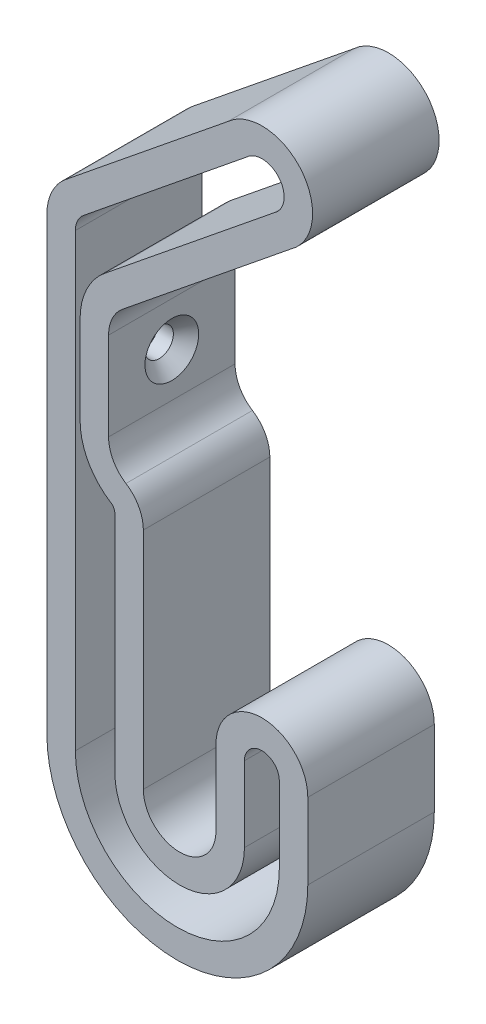
ISO-10303-21;
HEADER;
FILE_DESCRIPTION(('STEP AP214'),'2;1');
FILE_NAME('part.step','',(''),(''),'','','');
FILE_SCHEMA(('AUTOMOTIVE_DESIGN { 1 0 10303 214 1 1 1 1 }'));
ENDSEC;
DATA;
#1=APPLICATION_CONTEXT('core data for automotive mechanical design processes');
#2=APPLICATION_PROTOCOL_DEFINITION('international standard','automotive_design',2000,#1);
#3=PRODUCT_CONTEXT('',#1,'mechanical');
#4=PRODUCT('Part','Part','',(#3));
#5=PRODUCT_RELATED_PRODUCT_CATEGORY('part','',(#4));
#6=PRODUCT_DEFINITION_FORMATION('','',#4);
#7=PRODUCT_DEFINITION_CONTEXT('part definition',#1,'design');
#8=PRODUCT_DEFINITION('design','',#6,#7);
#9=PRODUCT_DEFINITION_SHAPE('','',#8);
#10=(LENGTH_UNIT() NAMED_UNIT(*) SI_UNIT(.MILLI.,.METRE.));
#11=(NAMED_UNIT(*) PLANE_ANGLE_UNIT() SI_UNIT($,.RADIAN.));
#12=(NAMED_UNIT(*) SI_UNIT($,.STERADIAN.) SOLID_ANGLE_UNIT());
#13=UNCERTAINTY_MEASURE_WITH_UNIT(LENGTH_MEASURE(1.E-05),#10,'distance_accuracy_value','');
#14=(GEOMETRIC_REPRESENTATION_CONTEXT(3) GLOBAL_UNCERTAINTY_ASSIGNED_CONTEXT((#13)) GLOBAL_UNIT_ASSIGNED_CONTEXT((#10,
#11,#12)) REPRESENTATION_CONTEXT('',''));
#15=CARTESIAN_POINT('',(0.,0.,0.));
#16=DIRECTION('',(0.,0.,1.));
#17=DIRECTION('',(1.,0.,0.));
#18=AXIS2_PLACEMENT_3D('',#15,#16,#17);
#19=CARTESIAN_POINT('',(8.,-29.1158042615853,20.));
#20=DIRECTION('',(0.,0.,1.));
#21=DIRECTION('',(1.,0.,0.));
#22=AXIS2_PLACEMENT_3D('',#19,#20,#21);
#23=PLANE('',#22);
#24=CARTESIAN_POINT('',(8.,-29.1158042615853,20.));
#25=DIRECTION('',(0.,0.,1.));
#26=DIRECTION('',(1.,0.,0.));
#27=AXIS2_PLACEMENT_3D('',#24,#25,#26);
#28=CIRCLE('',#27,8.);
#29=CARTESIAN_POINT('',(2.96543687160134,-22.8986365699295,20.));
#30=VERTEX_POINT('',#29);
#31=CARTESIAN_POINT('',(0.,-29.1158042615853,20.));
#32=VERTEX_POINT('',#31);
#33=EDGE_CURVE('E349',#30,#32,#28,.T.);
#34=ORIENTED_EDGE('',*,*,#33,.T.);
#35=DIRECTION('',(0.,-1.,0.));
#36=VECTOR('',#35,1.);
#37=CARTESIAN_POINT('',(0.,-100.352508148535,20.));
#38=LINE('',#37,#36);
#39=CARTESIAN_POINT('',(0.,-100.352508148535,20.));
#40=VERTEX_POINT('',#39);
#41=EDGE_CURVE('E352',#32,#40,#38,.T.);
#42=ORIENTED_EDGE('',*,*,#41,.T.);
#43=CARTESIAN_POINT('',(20.625,-100.352508148535,20.));
#44=DIRECTION('',(0.,0.,1.));
#45=DIRECTION('',(1.,0.,0.));
#46=AXIS2_PLACEMENT_3D('',#43,#44,#45);
#47=CIRCLE('',#46,20.625);
#48=CARTESIAN_POINT('',(41.25,-100.352508148535,20.));
#49=VERTEX_POINT('',#48);
#50=EDGE_CURVE('E355',#40,#49,#47,.T.);
#51=ORIENTED_EDGE('',*,*,#50,.T.);
#52=DIRECTION('',(0.,1.,0.));
#53=VECTOR('',#52,1.);
#54=CARTESIAN_POINT('',(41.25,-88.352508148535,20.));
#55=LINE('',#54,#53);
#56=CARTESIAN_POINT('',(41.25,-88.352508148535,20.));
#57=VERTEX_POINT('',#56);
#58=EDGE_CURVE('E357',#49,#57,#55,.T.);
#59=ORIENTED_EDGE('',*,*,#58,.T.);
#60=CARTESIAN_POINT('',(33.99,-88.352508148535,20.));
#61=DIRECTION('',(0.,0.,1.));
#62=DIRECTION('',(1.,0.,0.));
#63=AXIS2_PLACEMENT_3D('',#60,#61,#62);
#64=CIRCLE('',#63,7.26);
#65=CARTESIAN_POINT('',(26.73,-88.352508148535,20.));
#66=VERTEX_POINT('',#65);
#67=EDGE_CURVE('E359',#57,#66,#64,.T.);
#68=ORIENTED_EDGE('',*,*,#67,.T.);
#69=DIRECTION('',(0.,-1.,0.));
#70=VECTOR('',#69,1.);
#71=CARTESIAN_POINT('',(26.73,-100.252508148535,20.));
#72=LINE('',#71,#70);
#73=CARTESIAN_POINT('',(26.73,-100.252508148535,20.));
#74=VERTEX_POINT('',#73);
#75=EDGE_CURVE('E361',#66,#74,#72,.T.);
#76=ORIENTED_EDGE('',*,*,#75,.T.);
#77=CARTESIAN_POINT('',(20.99,-100.252508148535,20.));
#78=DIRECTION('',(0.,0.,-1.));
#79=DIRECTION('',(1.,0.,0.));
#80=AXIS2_PLACEMENT_3D('',#77,#78,#79);
#81=CIRCLE('',#80,5.74);
#82=CARTESIAN_POINT('',(15.25,-100.252508148535,20.));
#83=VERTEX_POINT('',#82);
#84=EDGE_CURVE('E363',#74,#83,#81,.T.);
#85=ORIENTED_EDGE('',*,*,#84,.T.);
#86=DIRECTION('',(0.,1.,0.));
#87=VECTOR('',#86,1.);
#88=CARTESIAN_POINT('',(15.25,-64.752508148535,20.));
#89=LINE('',#88,#87);
#90=CARTESIAN_POINT('',(15.25,-64.752508148535,20.));
#91=VERTEX_POINT('',#90);
#92=EDGE_CURVE('E365',#83,#91,#89,.T.);
#93=ORIENTED_EDGE('',*,*,#92,.T.);
#94=CARTESIAN_POINT('',(9.32954545454545,-64.752508148535,20.));
#95=DIRECTION('',(0.,0.,1.));
#96=DIRECTION('',(1.,0.,0.));
#97=AXIS2_PLACEMENT_3D('',#94,#95,#96);
#98=CIRCLE('',#97,5.92045454545455);
#99=CARTESIAN_POINT('',(12.5,-59.752508148535,20.));
#100=VERTEX_POINT('',#99);
#101=EDGE_CURVE('E367',#91,#100,#98,.T.);
#102=ORIENTED_EDGE('',*,*,#101,.T.);
#103=CARTESIAN_POINT('',(15.6704545454545,-54.752508148535,20.));
#104=DIRECTION('',(0.,0.,-1.));
#105=DIRECTION('',(1.,0.,0.));
#106=AXIS2_PLACEMENT_3D('',#103,#104,#105);
#107=CIRCLE('',#106,5.92045454545455);
#108=CARTESIAN_POINT('',(9.75,-54.752508148535,20.));
#109=VERTEX_POINT('',#108);
#110=EDGE_CURVE('E369',#100,#109,#107,.T.);
#111=ORIENTED_EDGE('',*,*,#110,.T.);
#112=DIRECTION('',(0.,1.,0.));
#113=VECTOR('',#112,1.);
#114=CARTESIAN_POINT('',(9.75,-40.814361344724,20.));
#115=LINE('',#114,#113);
#116=CARTESIAN_POINT('',(9.75,-40.814361344724,20.));
#117=VERTEX_POINT('',#116);
#118=EDGE_CURVE('E371',#109,#117,#115,.T.);
#119=ORIENTED_EDGE('',*,*,#118,.T.);
#120=CARTESIAN_POINT('',(15.75,-40.814361344724,20.));
#121=DIRECTION('',(0.,0.,-1.));
#122=DIRECTION('',(1.,0.,0.));
#123=AXIS2_PLACEMENT_3D('',#120,#121,#122);
#124=CIRCLE('',#123,6.);
#125=CARTESIAN_POINT('',(11.974077653701,-36.1514855759821,20.));
#126=VERTEX_POINT('',#125);
#127=EDGE_CURVE('E373',#117,#126,#124,.T.);
#128=ORIENTED_EDGE('',*,*,#127,.T.);
#129=DIRECTION('',(0.777145961456972,0.629320391049836,0.));
#130=VECTOR('',#129,1.);
#131=CARTESIAN_POINT('',(38.6484121332572,-14.5510354183345,20.));
#132=LINE('',#131,#130);
#133=CARTESIAN_POINT('',(38.6484121332572,-14.5510354183345,20.));
#134=VERTEX_POINT('',#133);
#135=EDGE_CURVE('E375',#126,#134,#132,.T.);
#136=ORIENTED_EDGE('',*,*,#135,.T.);
#137=CARTESIAN_POINT('',(34.0122647381654,-8.03136231832538,20.));
#138=DIRECTION('',(0.,0.,1.));
#139=DIRECTION('',(1.,0.,0.));
#140=AXIS2_PLACEMENT_3D('',#137,#138,#139);
#141=CIRCLE('',#140,8.);
#142=CARTESIAN_POINT('',(28.5989713816166,-2.14100960936603,20.));
#143=VERTEX_POINT('',#142);
#144=EDGE_CURVE('E377',#134,#143,#141,.T.);
#145=ORIENTED_EDGE('',*,*,#144,.T.);
#146=DIRECTION('',(-0.777145961456972,-0.629320391049836,0.));
#147=VECTOR('',#146,1.);
#148=CARTESIAN_POINT('',(2.96543687160134,-22.8986365699295,20.));
#149=LINE('',#148,#147);
#150=EDGE_CURVE('E379',#143,#30,#149,.T.);
#151=ORIENTED_EDGE('',*,*,#150,.T.);
#152=EDGE_LOOP('',(#34,#42,#51,#59,#68,#76,#85,#93,#102,#111,#119,#128,#136,#145,#151));
#153=FACE_BOUND('',#152,.T.);
#154=DIRECTION('',(0.,1.,0.));
#155=VECTOR('',#154,1.);
#156=CARTESIAN_POINT('',(36.75,-88.352508148535,20.));
#157=LINE('',#156,#155);
#158=CARTESIAN_POINT('',(36.75,-100.352508148535,20.));
#159=VERTEX_POINT('',#158);
#160=CARTESIAN_POINT('',(36.75,-88.352508148535,20.));
#161=VERTEX_POINT('',#160);
#162=EDGE_CURVE('E241',#159,#161,#157,.T.);
#163=ORIENTED_EDGE('',*,*,#162,.F.);
#164=CARTESIAN_POINT('',(20.625,-100.352508148535,20.));
#165=DIRECTION('',(0.,0.,1.));
#166=DIRECTION('',(1.,0.,0.));
#167=AXIS2_PLACEMENT_3D('',#164,#165,#166);
#168=CIRCLE('',#167,16.125);
#169=CARTESIAN_POINT('',(4.5,-100.352508148535,20.));
#170=VERTEX_POINT('',#169);
#171=EDGE_CURVE('E233',#170,#159,#168,.T.);
#172=ORIENTED_EDGE('',*,*,#171,.F.);
#173=DIRECTION('',(0.,-1.,0.));
#174=VECTOR('',#173,1.);
#175=CARTESIAN_POINT('',(4.5,-100.352508148535,20.));
#176=LINE('',#175,#174);
#177=CARTESIAN_POINT('',(4.5,-29.1158042615853,20.));
#178=VERTEX_POINT('',#177);
#179=EDGE_CURVE('E281',#178,#170,#176,.T.);
#180=ORIENTED_EDGE('',*,*,#179,.F.);
#181=CARTESIAN_POINT('',(8.,-29.1158042615853,20.));
#182=DIRECTION('',(0.,0.,1.));
#183=DIRECTION('',(1.,0.,0.));
#184=AXIS2_PLACEMENT_3D('',#181,#182,#183);
#185=CIRCLE('',#184,3.5);
#186=CARTESIAN_POINT('',(5.79737863132559,-26.3957933964859,20.));
#187=VERTEX_POINT('',#186);
#188=EDGE_CURVE('E279',#187,#178,#185,.T.);
#189=ORIENTED_EDGE('',*,*,#188,.F.);
#190=DIRECTION('',(-0.777145961456972,-0.629320391049836,0.));
#191=VECTOR('',#190,1.);
#192=CARTESIAN_POINT('',(5.79737863132559,-26.3957933964859,20.));
#193=LINE('',#192,#191);
#194=CARTESIAN_POINT('',(31.5626309732251,-5.5315034387755,20.));
#195=VERTEX_POINT('',#194);
#196=EDGE_CURVE('E277',#195,#187,#193,.T.);
#197=ORIENTED_EDGE('',*,*,#196,.F.);
#198=CARTESIAN_POINT('',(34.0122647381654,-8.03136231832538,20.));
#199=DIRECTION('',(0.,0.,1.));
#200=DIRECTION('',(1.,0.,0.));
#201=AXIS2_PLACEMENT_3D('',#198,#199,#200);
#202=CIRCLE('',#201,3.49999999999999);
#203=CARTESIAN_POINT('',(35.9481882054172,-10.9472155946312,20.));
#204=VERTEX_POINT('',#203);
#205=EDGE_CURVE('E275',#204,#195,#202,.T.);
#206=ORIENTED_EDGE('',*,*,#205,.F.);
#207=DIRECTION('',(0.777145961456972,0.629320391049836,0.));
#208=VECTOR('',#207,1.);
#209=CARTESIAN_POINT('',(35.9481882054172,-10.9472155946312,20.));
#210=LINE('',#209,#208);
#211=CARTESIAN_POINT('',(9.14213589397672,-32.6543287494258,20.));
#212=VERTEX_POINT('',#211);
#213=EDGE_CURVE('E273',#212,#204,#210,.T.);
#214=ORIENTED_EDGE('',*,*,#213,.F.);
#215=CARTESIAN_POINT('',(15.75,-40.814361344724,20.));
#216=DIRECTION('',(0.,0.,-1.));
#217=DIRECTION('',(1.,0.,0.));
#218=AXIS2_PLACEMENT_3D('',#215,#216,#217);
#219=CIRCLE('',#218,10.5);
#220=CARTESIAN_POINT('',(5.25,-40.8143613447241,20.));
#221=VERTEX_POINT('',#220);
#222=EDGE_CURVE('E271',#221,#212,#219,.T.);
#223=ORIENTED_EDGE('',*,*,#222,.F.);
#224=DIRECTION('',(0.,1.,0.));
#225=VECTOR('',#224,1.);
#226=CARTESIAN_POINT('',(5.25,-40.8143613447241,20.));
#227=LINE('',#226,#225);
#228=CARTESIAN_POINT('',(5.25,-54.752508148535,20.));
#229=VERTEX_POINT('',#228);
#230=EDGE_CURVE('E269',#229,#221,#227,.T.);
#231=ORIENTED_EDGE('',*,*,#230,.F.);
#232=CARTESIAN_POINT('',(15.6704545454545,-54.752508148535,20.));
#233=DIRECTION('',(0.,0.,-1.));
#234=DIRECTION('',(1.,0.,0.));
#235=AXIS2_PLACEMENT_3D('',#232,#233,#234);
#236=CIRCLE('',#235,10.4204545454545);
#237=CARTESIAN_POINT('',(10.0902111324376,-63.5528920256943,20.));
#238=VERTEX_POINT('',#237);
#239=EDGE_CURVE('E267',#238,#229,#236,.T.);
#240=ORIENTED_EDGE('',*,*,#239,.F.);
#241=CARTESIAN_POINT('',(9.32954545454545,-64.752508148535,20.));
#242=DIRECTION('',(0.,0.,1.));
#243=DIRECTION('',(1.,0.,0.));
#244=AXIS2_PLACEMENT_3D('',#241,#242,#243);
#245=CIRCLE('',#244,1.42045454545455);
#246=CARTESIAN_POINT('',(10.75,-64.752508148535,20.));
#247=VERTEX_POINT('',#246);
#248=EDGE_CURVE('E265',#247,#238,#245,.T.);
#249=ORIENTED_EDGE('',*,*,#248,.F.);
#250=DIRECTION('',(0.,1.,0.));
#251=VECTOR('',#250,1.);
#252=CARTESIAN_POINT('',(10.75,-64.752508148535,20.));
#253=LINE('',#252,#251);
#254=CARTESIAN_POINT('',(10.75,-100.252508148535,20.));
#255=VERTEX_POINT('',#254);
#256=EDGE_CURVE('E263',#255,#247,#253,.T.);
#257=ORIENTED_EDGE('',*,*,#256,.F.);
#258=CARTESIAN_POINT('',(20.99,-100.252508148535,20.));
#259=DIRECTION('',(0.,0.,-1.));
#260=DIRECTION('',(1.,0.,0.));
#261=AXIS2_PLACEMENT_3D('',#258,#259,#260);
#262=CIRCLE('',#261,10.24);
#263=CARTESIAN_POINT('',(31.23,-100.252508148535,20.));
#264=VERTEX_POINT('',#263);
#265=EDGE_CURVE('E261',#264,#255,#262,.T.);
#266=ORIENTED_EDGE('',*,*,#265,.F.);
#267=DIRECTION('',(0.,-1.,0.));
#268=VECTOR('',#267,1.);
#269=CARTESIAN_POINT('',(31.23,-100.252508148535,20.));
#270=LINE('',#269,#268);
#271=CARTESIAN_POINT('',(31.23,-88.352508148535,20.));
#272=VERTEX_POINT('',#271);
#273=EDGE_CURVE('E256',#272,#264,#270,.T.);
#274=ORIENTED_EDGE('',*,*,#273,.F.);
#275=CARTESIAN_POINT('',(33.99,-88.352508148535,20.));
#276=DIRECTION('',(0.,0.,1.));
#277=DIRECTION('',(1.,0.,0.));
#278=AXIS2_PLACEMENT_3D('',#275,#276,#277);
#279=CIRCLE('',#278,2.76000000000001);
#280=EDGE_CURVE('E254',#161,#272,#279,.T.);
#281=ORIENTED_EDGE('',*,*,#280,.F.);
#282=EDGE_LOOP('',(#163,#172,#180,#189,#197,#206,#214,#223,#231,#240,#249,#257,#266,#274,#281));
#283=FACE_BOUND('',#282,.T.);
#284=ADVANCED_FACE('F35',(#153,#283),#23,.T.);
#285=CARTESIAN_POINT('',(8.,-29.1158042615853,0.));
#286=DIRECTION('',(0.,0.,1.));
#287=DIRECTION('',(1.,0.,0.));
#288=AXIS2_PLACEMENT_3D('',#285,#286,#287);
#289=PLANE('',#288);
#290=CARTESIAN_POINT('',(8.,-29.1158042615853,0.));
#291=DIRECTION('',(0.,0.,1.));
#292=DIRECTION('',(1.,0.,0.));
#293=AXIS2_PLACEMENT_3D('',#290,#291,#292);
#294=CIRCLE('',#293,8.);
#295=CARTESIAN_POINT('',(2.96543687160134,-22.8986365699295,0.));
#296=VERTEX_POINT('',#295);
#297=CARTESIAN_POINT('',(0.,-29.1158042615853,0.));
#298=VERTEX_POINT('',#297);
#299=EDGE_CURVE('E249',#296,#298,#294,.T.);
#300=ORIENTED_EDGE('',*,*,#299,.F.);
#301=DIRECTION('',(-0.777145961456972,-0.629320391049836,0.));
#302=VECTOR('',#301,1.);
#303=CARTESIAN_POINT('',(2.96543687160134,-22.8986365699295,0.));
#304=LINE('',#303,#302);
#305=CARTESIAN_POINT('',(28.5989713816166,-2.14100960936603,0.));
#306=VERTEX_POINT('',#305);
#307=EDGE_CURVE('E353',#306,#296,#304,.T.);
#308=ORIENTED_EDGE('',*,*,#307,.F.);
#309=CARTESIAN_POINT('',(34.0122647381654,-8.03136231832538,0.));
#310=DIRECTION('',(0.,0.,1.));
#311=DIRECTION('',(1.,0.,0.));
#312=AXIS2_PLACEMENT_3D('',#309,#310,#311);
#313=CIRCLE('',#312,8.);
#314=CARTESIAN_POINT('',(38.6484121332572,-14.5510354183345,0.));
#315=VERTEX_POINT('',#314);
#316=EDGE_CURVE('E408',#315,#306,#313,.T.);
#317=ORIENTED_EDGE('',*,*,#316,.F.);
#318=DIRECTION('',(0.777145961456972,0.629320391049836,0.));
#319=VECTOR('',#318,1.);
#320=CARTESIAN_POINT('',(38.6484121332572,-14.5510354183345,0.));
#321=LINE('',#320,#319);
#322=CARTESIAN_POINT('',(11.974077653701,-36.1514855759821,0.));
#323=VERTEX_POINT('',#322);
#324=EDGE_CURVE('E406',#323,#315,#321,.T.);
#325=ORIENTED_EDGE('',*,*,#324,.F.);
#326=CARTESIAN_POINT('',(15.75,-40.814361344724,0.));
#327=DIRECTION('',(0.,0.,-1.));
#328=DIRECTION('',(1.,0.,0.));
#329=AXIS2_PLACEMENT_3D('',#326,#327,#328);
#330=CIRCLE('',#329,6.);
#331=CARTESIAN_POINT('',(9.75,-40.814361344724,0.));
#332=VERTEX_POINT('',#331);
#333=EDGE_CURVE('E404',#332,#323,#330,.T.);
#334=ORIENTED_EDGE('',*,*,#333,.F.);
#335=DIRECTION('',(0.,1.,0.));
#336=VECTOR('',#335,1.);
#337=CARTESIAN_POINT('',(9.75,-40.814361344724,0.));
#338=LINE('',#337,#336);
#339=CARTESIAN_POINT('',(9.75,-54.752508148535,0.));
#340=VERTEX_POINT('',#339);
#341=EDGE_CURVE('E402',#340,#332,#338,.T.);
#342=ORIENTED_EDGE('',*,*,#341,.F.);
#343=CARTESIAN_POINT('',(15.6704545454545,-54.752508148535,0.));
#344=DIRECTION('',(0.,0.,-1.));
#345=DIRECTION('',(1.,0.,0.));
#346=AXIS2_PLACEMENT_3D('',#343,#344,#345);
#347=CIRCLE('',#346,5.92045454545455);
#348=CARTESIAN_POINT('',(12.5,-59.752508148535,0.));
#349=VERTEX_POINT('',#348);
#350=EDGE_CURVE('E400',#349,#340,#347,.T.);
#351=ORIENTED_EDGE('',*,*,#350,.F.);
#352=CARTESIAN_POINT('',(9.32954545454545,-64.752508148535,0.));
#353=DIRECTION('',(0.,0.,1.));
#354=DIRECTION('',(1.,0.,0.));
#355=AXIS2_PLACEMENT_3D('',#352,#353,#354);
#356=CIRCLE('',#355,5.92045454545455);
#357=CARTESIAN_POINT('',(15.25,-64.752508148535,0.));
#358=VERTEX_POINT('',#357);
#359=EDGE_CURVE('E398',#358,#349,#356,.T.);
#360=ORIENTED_EDGE('',*,*,#359,.F.);
#361=DIRECTION('',(0.,1.,0.));
#362=VECTOR('',#361,1.);
#363=CARTESIAN_POINT('',(15.25,-64.752508148535,0.));
#364=LINE('',#363,#362);
#365=CARTESIAN_POINT('',(15.25,-100.252508148535,0.));
#366=VERTEX_POINT('',#365);
#367=EDGE_CURVE('E396',#366,#358,#364,.T.);
#368=ORIENTED_EDGE('',*,*,#367,.F.);
#369=CARTESIAN_POINT('',(20.99,-100.252508148535,0.));
#370=DIRECTION('',(0.,0.,-1.));
#371=DIRECTION('',(1.,0.,0.));
#372=AXIS2_PLACEMENT_3D('',#369,#370,#371);
#373=CIRCLE('',#372,5.74);
#374=CARTESIAN_POINT('',(26.73,-100.252508148535,0.));
#375=VERTEX_POINT('',#374);
#376=EDGE_CURVE('E394',#375,#366,#373,.T.);
#377=ORIENTED_EDGE('',*,*,#376,.F.);
#378=DIRECTION('',(0.,-1.,0.));
#379=VECTOR('',#378,1.);
#380=CARTESIAN_POINT('',(26.73,-100.252508148535,0.));
#381=LINE('',#380,#379);
#382=CARTESIAN_POINT('',(26.73,-88.352508148535,0.));
#383=VERTEX_POINT('',#382);
#384=EDGE_CURVE('E392',#383,#375,#381,.T.);
#385=ORIENTED_EDGE('',*,*,#384,.F.);
#386=CARTESIAN_POINT('',(33.99,-88.352508148535,0.));
#387=DIRECTION('',(0.,0.,1.));
#388=DIRECTION('',(1.,0.,0.));
#389=AXIS2_PLACEMENT_3D('',#386,#387,#388);
#390=CIRCLE('',#389,7.26);
#391=CARTESIAN_POINT('',(41.25,-88.352508148535,0.));
#392=VERTEX_POINT('',#391);
#393=EDGE_CURVE('E390',#392,#383,#390,.T.);
#394=ORIENTED_EDGE('',*,*,#393,.F.);
#395=DIRECTION('',(0.,1.,0.));
#396=VECTOR('',#395,1.);
#397=CARTESIAN_POINT('',(41.25,-88.352508148535,0.));
#398=LINE('',#397,#396);
#399=CARTESIAN_POINT('',(41.25,-100.352508148535,0.));
#400=VERTEX_POINT('',#399);
#401=EDGE_CURVE('E388',#400,#392,#398,.T.);
#402=ORIENTED_EDGE('',*,*,#401,.F.);
#403=CARTESIAN_POINT('',(20.625,-100.352508148535,0.));
#404=DIRECTION('',(0.,0.,1.));
#405=DIRECTION('',(1.,0.,0.));
#406=AXIS2_PLACEMENT_3D('',#403,#404,#405);
#407=CIRCLE('',#406,20.625);
#408=CARTESIAN_POINT('',(0.,-100.352508148535,0.));
#409=VERTEX_POINT('',#408);
#410=EDGE_CURVE('E386',#409,#400,#407,.T.);
#411=ORIENTED_EDGE('',*,*,#410,.F.);
#412=DIRECTION('',(0.,-1.,0.));
#413=VECTOR('',#412,1.);
#414=CARTESIAN_POINT('',(0.,-100.352508148535,0.));
#415=LINE('',#414,#413);
#416=EDGE_CURVE('E384',#298,#409,#415,.T.);
#417=ORIENTED_EDGE('',*,*,#416,.F.);
#418=EDGE_LOOP('',(#300,#308,#317,#325,#334,#342,#351,#360,#368,#377,#385,#394,#402,#411,#417));
#419=FACE_BOUND('',#418,.T.);
#420=CARTESIAN_POINT('',(20.625,-100.352508148535,0.));
#421=DIRECTION('',(0.,0.,1.));
#422=DIRECTION('',(1.,0.,0.));
#423=AXIS2_PLACEMENT_3D('',#420,#421,#422);
#424=CIRCLE('',#423,16.125);
#425=CARTESIAN_POINT('',(4.5,-100.352508148535,0.));
#426=VERTEX_POINT('',#425);
#427=CARTESIAN_POINT('',(36.75,-100.352508148535,0.));
#428=VERTEX_POINT('',#427);
#429=EDGE_CURVE('E59',#426,#428,#424,.T.);
#430=ORIENTED_EDGE('',*,*,#429,.T.);
#431=DIRECTION('',(0.,1.,0.));
#432=VECTOR('',#431,1.);
#433=CARTESIAN_POINT('',(36.75,-88.352508148535,0.));
#434=LINE('',#433,#432);
#435=CARTESIAN_POINT('',(36.75,-88.352508148535,0.));
#436=VERTEX_POINT('',#435);
#437=EDGE_CURVE('E248',#428,#436,#434,.T.);
#438=ORIENTED_EDGE('',*,*,#437,.T.);
#439=CARTESIAN_POINT('',(33.99,-88.352508148535,0.));
#440=DIRECTION('',(0.,0.,1.));
#441=DIRECTION('',(1.,0.,0.));
#442=AXIS2_PLACEMENT_3D('',#439,#440,#441);
#443=CIRCLE('',#442,2.76000000000001);
#444=CARTESIAN_POINT('',(31.23,-88.352508148535,0.));
#445=VERTEX_POINT('',#444);
#446=EDGE_CURVE('E286',#436,#445,#443,.T.);
#447=ORIENTED_EDGE('',*,*,#446,.T.);
#448=DIRECTION('',(0.,-1.,0.));
#449=VECTOR('',#448,1.);
#450=CARTESIAN_POINT('',(31.23,-100.252508148535,0.));
#451=LINE('',#450,#449);
#452=CARTESIAN_POINT('',(31.23,-100.252508148535,0.));
#453=VERTEX_POINT('',#452);
#454=EDGE_CURVE('E289',#445,#453,#451,.T.);
#455=ORIENTED_EDGE('',*,*,#454,.T.);
#456=CARTESIAN_POINT('',(20.99,-100.252508148535,0.));
#457=DIRECTION('',(0.,0.,-1.));
#458=DIRECTION('',(1.,0.,0.));
#459=AXIS2_PLACEMENT_3D('',#456,#457,#458);
#460=CIRCLE('',#459,10.24);
#461=CARTESIAN_POINT('',(10.75,-100.252508148535,0.));
#462=VERTEX_POINT('',#461);
#463=EDGE_CURVE('E292',#453,#462,#460,.T.);
#464=ORIENTED_EDGE('',*,*,#463,.T.);
#465=DIRECTION('',(0.,1.,0.));
#466=VECTOR('',#465,1.);
#467=CARTESIAN_POINT('',(10.75,-64.752508148535,0.));
#468=LINE('',#467,#466);
#469=CARTESIAN_POINT('',(10.75,-64.752508148535,0.));
#470=VERTEX_POINT('',#469);
#471=EDGE_CURVE('E295',#462,#470,#468,.T.);
#472=ORIENTED_EDGE('',*,*,#471,.T.);
#473=CARTESIAN_POINT('',(9.32954545454545,-64.752508148535,0.));
#474=DIRECTION('',(0.,0.,1.));
#475=DIRECTION('',(1.,0.,0.));
#476=AXIS2_PLACEMENT_3D('',#473,#474,#475);
#477=CIRCLE('',#476,1.42045454545455);
#478=CARTESIAN_POINT('',(10.0902111324376,-63.5528920256943,0.));
#479=VERTEX_POINT('',#478);
#480=EDGE_CURVE('E298',#470,#479,#477,.T.);
#481=ORIENTED_EDGE('',*,*,#480,.T.);
#482=CARTESIAN_POINT('',(15.6704545454545,-54.752508148535,0.));
#483=DIRECTION('',(0.,0.,-1.));
#484=DIRECTION('',(1.,0.,0.));
#485=AXIS2_PLACEMENT_3D('',#482,#483,#484);
#486=CIRCLE('',#485,10.4204545454545);
#487=CARTESIAN_POINT('',(5.25,-54.752508148535,0.));
#488=VERTEX_POINT('',#487);
#489=EDGE_CURVE('E301',#479,#488,#486,.T.);
#490=ORIENTED_EDGE('',*,*,#489,.T.);
#491=DIRECTION('',(0.,1.,0.));
#492=VECTOR('',#491,1.);
#493=CARTESIAN_POINT('',(5.25,-40.8143613447241,0.));
#494=LINE('',#493,#492);
#495=CARTESIAN_POINT('',(5.25,-40.8143613447241,0.));
#496=VERTEX_POINT('',#495);
#497=EDGE_CURVE('E304',#488,#496,#494,.T.);
#498=ORIENTED_EDGE('',*,*,#497,.T.);
#499=CARTESIAN_POINT('',(15.75,-40.814361344724,0.));
#500=DIRECTION('',(0.,0.,-1.));
#501=DIRECTION('',(1.,0.,0.));
#502=AXIS2_PLACEMENT_3D('',#499,#500,#501);
#503=CIRCLE('',#502,10.5);
#504=CARTESIAN_POINT('',(9.14213589397672,-32.6543287494258,0.));
#505=VERTEX_POINT('',#504);
#506=EDGE_CURVE('E307',#496,#505,#503,.T.);
#507=ORIENTED_EDGE('',*,*,#506,.T.);
#508=DIRECTION('',(0.777145961456972,0.629320391049836,0.));
#509=VECTOR('',#508,1.);
#510=CARTESIAN_POINT('',(35.9481882054172,-10.9472155946312,0.));
#511=LINE('',#510,#509);
#512=CARTESIAN_POINT('',(35.9481882054172,-10.9472155946312,0.));
#513=VERTEX_POINT('',#512);
#514=EDGE_CURVE('E310',#505,#513,#511,.T.);
#515=ORIENTED_EDGE('',*,*,#514,.T.);
#516=CARTESIAN_POINT('',(34.0122647381654,-8.03136231832538,0.));
#517=DIRECTION('',(0.,0.,1.));
#518=DIRECTION('',(1.,0.,0.));
#519=AXIS2_PLACEMENT_3D('',#516,#517,#518);
#520=CIRCLE('',#519,3.49999999999999);
#521=CARTESIAN_POINT('',(31.5626309732251,-5.5315034387755,0.));
#522=VERTEX_POINT('',#521);
#523=EDGE_CURVE('E313',#513,#522,#520,.T.);
#524=ORIENTED_EDGE('',*,*,#523,.T.);
#525=DIRECTION('',(-0.777145961456972,-0.629320391049836,0.));
#526=VECTOR('',#525,1.);
#527=CARTESIAN_POINT('',(5.79737863132559,-26.3957933964859,0.));
#528=LINE('',#527,#526);
#529=CARTESIAN_POINT('',(5.79737863132559,-26.3957933964859,0.));
#530=VERTEX_POINT('',#529);
#531=EDGE_CURVE('E316',#522,#530,#528,.T.);
#532=ORIENTED_EDGE('',*,*,#531,.T.);
#533=CARTESIAN_POINT('',(8.,-29.1158042615853,0.));
#534=DIRECTION('',(0.,0.,1.));
#535=DIRECTION('',(1.,0.,0.));
#536=AXIS2_PLACEMENT_3D('',#533,#534,#535);
#537=CIRCLE('',#536,3.5);
#538=CARTESIAN_POINT('',(4.5,-29.1158042615853,0.));
#539=VERTEX_POINT('',#538);
#540=EDGE_CURVE('E319',#530,#539,#537,.T.);
#541=ORIENTED_EDGE('',*,*,#540,.T.);
#542=DIRECTION('',(0.,-1.,0.));
#543=VECTOR('',#542,1.);
#544=CARTESIAN_POINT('',(4.5,-100.352508148535,0.));
#545=LINE('',#544,#543);
#546=EDGE_CURVE('E242',#539,#426,#545,.T.);
#547=ORIENTED_EDGE('',*,*,#546,.T.);
#548=EDGE_LOOP('',(#430,#438,#447,#455,#464,#472,#481,#490,#498,#507,#515,#524,#532,#541,#547));
#549=FACE_BOUND('',#548,.T.);
#550=ADVANCED_FACE('F475',(#419,#549),#289,.F.);
#551=CARTESIAN_POINT('',(8.,-29.1158042615853,20.));
#552=DIRECTION('',(0.,0.,-1.));
#553=DIRECTION('',(-1.,0.,0.));
#554=AXIS2_PLACEMENT_3D('',#551,#552,#553);
#555=CYLINDRICAL_SURFACE('',#554,8.);
#556=ORIENTED_EDGE('',*,*,#299,.T.);
#557=DIRECTION('',(0.,0.,-1.));
#558=VECTOR('',#557,1.);
#559=CARTESIAN_POINT('',(0.,-29.1158042615853,20.));
#560=LINE('',#559,#558);
#561=EDGE_CURVE('E452',#32,#298,#560,.T.);
#562=ORIENTED_EDGE('',*,*,#561,.F.);
#563=ORIENTED_EDGE('',*,*,#33,.F.);
#564=DIRECTION('',(0.,0.,-1.));
#565=VECTOR('',#564,1.);
#566=CARTESIAN_POINT('',(2.96543687160134,-22.8986365699295,20.));
#567=LINE('',#566,#565);
#568=EDGE_CURVE('E381',#30,#296,#567,.T.);
#569=ORIENTED_EDGE('',*,*,#568,.T.);
#570=EDGE_LOOP('',(#556,#562,#563,#569));
#571=FACE_BOUND('',#570,.T.);
#572=ADVANCED_FACE('F481',(#571),#555,.T.);
#573=CARTESIAN_POINT('',(0.,-100.352508148535,20.));
#574=DIRECTION('',(1.,0.,0.));
#575=DIRECTION('',(0.,0.,-1.));
#576=AXIS2_PLACEMENT_3D('',#573,#574,#575);
#577=PLANE('',#576);
#578=CARTESIAN_POINT('',(0.,-47.7834347466295,10.));
#579=DIRECTION('',(1.,0.,0.));
#580=DIRECTION('',(0.,1.,0.));
#581=AXIS2_PLACEMENT_3D('',#578,#579,#580);
#582=CIRCLE('',#581,2.25);
#583=CARTESIAN_POINT('',(0.,-45.5334347466295,10.));
#584=VERTEX_POINT('',#583);
#585=EDGE_CURVE('E457',#584,#584,#582,.T.);
#586=ORIENTED_EDGE('',*,*,#585,.T.);
#587=EDGE_LOOP('',(#586));
#588=FACE_BOUND('',#587,.T.);
#589=ORIENTED_EDGE('',*,*,#416,.T.);
#590=DIRECTION('',(0.,0.,-1.));
#591=VECTOR('',#590,1.);
#592=CARTESIAN_POINT('',(0.,-100.352508148535,20.));
#593=LINE('',#592,#591);
#594=EDGE_CURVE('E449',#40,#409,#593,.T.);
#595=ORIENTED_EDGE('',*,*,#594,.F.);
#596=ORIENTED_EDGE('',*,*,#41,.F.);
#597=ORIENTED_EDGE('',*,*,#561,.T.);
#598=EDGE_LOOP('',(#589,#595,#596,#597));
#599=FACE_BOUND('',#598,.T.);
#600=ADVANCED_FACE('F536',(#588,#599),#577,.F.);
#601=CARTESIAN_POINT('',(20.625,-100.352508148535,20.));
#602=DIRECTION('',(0.,0.,-1.));
#603=DIRECTION('',(-1.,0.,0.));
#604=AXIS2_PLACEMENT_3D('',#601,#602,#603);
#605=CYLINDRICAL_SURFACE('',#604,20.625);
#606=ORIENTED_EDGE('',*,*,#410,.T.);
#607=DIRECTION('',(0.,0.,-1.));
#608=VECTOR('',#607,1.);
#609=CARTESIAN_POINT('',(41.25,-100.352508148535,20.));
#610=LINE('',#609,#608);
#611=EDGE_CURVE('E446',#49,#400,#610,.T.);
#612=ORIENTED_EDGE('',*,*,#611,.F.);
#613=ORIENTED_EDGE('',*,*,#50,.F.);
#614=ORIENTED_EDGE('',*,*,#594,.T.);
#615=EDGE_LOOP('',(#606,#612,#613,#614));
#616=FACE_BOUND('',#615,.T.);
#617=ADVANCED_FACE('F532',(#616),#605,.T.);
#618=CARTESIAN_POINT('',(41.25,-88.352508148535,20.));
#619=DIRECTION('',(-1.,0.,0.));
#620=DIRECTION('',(0.,0.,1.));
#621=AXIS2_PLACEMENT_3D('',#618,#619,#620);
#622=PLANE('',#621);
#623=ORIENTED_EDGE('',*,*,#401,.T.);
#624=DIRECTION('',(0.,0.,-1.));
#625=VECTOR('',#624,1.);
#626=CARTESIAN_POINT('',(41.25,-88.352508148535,20.));
#627=LINE('',#626,#625);
#628=EDGE_CURVE('E443',#57,#392,#627,.T.);
#629=ORIENTED_EDGE('',*,*,#628,.F.);
#630=ORIENTED_EDGE('',*,*,#58,.F.);
#631=ORIENTED_EDGE('',*,*,#611,.T.);
#632=EDGE_LOOP('',(#623,#629,#630,#631));
#633=FACE_BOUND('',#632,.T.);
#634=ADVANCED_FACE('F528',(#633),#622,.F.);
#635=CARTESIAN_POINT('',(33.99,-88.352508148535,20.));
#636=DIRECTION('',(0.,0.,-1.));
#637=DIRECTION('',(-1.,0.,0.));
#638=AXIS2_PLACEMENT_3D('',#635,#636,#637);
#639=CYLINDRICAL_SURFACE('',#638,7.26);
#640=ORIENTED_EDGE('',*,*,#393,.T.);
#641=DIRECTION('',(0.,0.,-1.));
#642=VECTOR('',#641,1.);
#643=CARTESIAN_POINT('',(26.73,-88.352508148535,20.));
#644=LINE('',#643,#642);
#645=EDGE_CURVE('E440',#66,#383,#644,.T.);
#646=ORIENTED_EDGE('',*,*,#645,.F.);
#647=ORIENTED_EDGE('',*,*,#67,.F.);
#648=ORIENTED_EDGE('',*,*,#628,.T.);
#649=EDGE_LOOP('',(#640,#646,#647,#648));
#650=FACE_BOUND('',#649,.T.);
#651=ADVANCED_FACE('F524',(#650),#639,.T.);
#652=CARTESIAN_POINT('',(26.73,-100.252508148535,20.));
#653=DIRECTION('',(1.,0.,0.));
#654=DIRECTION('',(0.,0.,-1.));
#655=AXIS2_PLACEMENT_3D('',#652,#653,#654);
#656=PLANE('',#655);
#657=ORIENTED_EDGE('',*,*,#384,.T.);
#658=DIRECTION('',(0.,0.,-1.));
#659=VECTOR('',#658,1.);
#660=CARTESIAN_POINT('',(26.73,-100.252508148535,20.));
#661=LINE('',#660,#659);
#662=EDGE_CURVE('E437',#74,#375,#661,.T.);
#663=ORIENTED_EDGE('',*,*,#662,.F.);
#664=ORIENTED_EDGE('',*,*,#75,.F.);
#665=ORIENTED_EDGE('',*,*,#645,.T.);
#666=EDGE_LOOP('',(#657,#663,#664,#665));
#667=FACE_BOUND('',#666,.T.);
#668=ADVANCED_FACE('F520',(#667),#656,.F.);
#669=CARTESIAN_POINT('',(20.99,-100.252508148535,20.));
#670=DIRECTION('',(0.,0.,-1.));
#671=DIRECTION('',(-1.,0.,0.));
#672=AXIS2_PLACEMENT_3D('',#669,#670,#671);
#673=CYLINDRICAL_SURFACE('',#672,5.74);
#674=ORIENTED_EDGE('',*,*,#376,.T.);
#675=DIRECTION('',(0.,0.,-1.));
#676=VECTOR('',#675,1.);
#677=CARTESIAN_POINT('',(15.25,-100.252508148535,20.));
#678=LINE('',#677,#676);
#679=EDGE_CURVE('E434',#83,#366,#678,.T.);
#680=ORIENTED_EDGE('',*,*,#679,.F.);
#681=ORIENTED_EDGE('',*,*,#84,.F.);
#682=ORIENTED_EDGE('',*,*,#662,.T.);
#683=EDGE_LOOP('',(#674,#680,#681,#682));
#684=FACE_BOUND('',#683,.T.);
#685=ADVANCED_FACE('F516',(#684),#673,.F.);
#686=CARTESIAN_POINT('',(15.25,-64.752508148535,20.));
#687=DIRECTION('',(-1.,0.,0.));
#688=DIRECTION('',(0.,-1.,0.));
#689=AXIS2_PLACEMENT_3D('',#686,#687,#688);
#690=PLANE('',#689);
#691=ORIENTED_EDGE('',*,*,#367,.T.);
#692=DIRECTION('',(0.,0.,-1.));
#693=VECTOR('',#692,1.);
#694=CARTESIAN_POINT('',(15.25,-64.752508148535,20.));
#695=LINE('',#694,#693);
#696=EDGE_CURVE('E431',#91,#358,#695,.T.);
#697=ORIENTED_EDGE('',*,*,#696,.F.);
#698=ORIENTED_EDGE('',*,*,#92,.F.);
#699=ORIENTED_EDGE('',*,*,#679,.T.);
#700=EDGE_LOOP('',(#691,#697,#698,#699));
#701=FACE_BOUND('',#700,.T.);
#702=ADVANCED_FACE('F512',(#701),#690,.F.);
#703=CARTESIAN_POINT('',(9.32954545454545,-64.752508148535,20.));
#704=DIRECTION('',(0.,0.,-1.));
#705=DIRECTION('',(-1.,0.,0.));
#706=AXIS2_PLACEMENT_3D('',#703,#704,#705);
#707=CYLINDRICAL_SURFACE('',#706,5.92045454545455);
#708=ORIENTED_EDGE('',*,*,#359,.T.);
#709=DIRECTION('',(0.,0.,-1.));
#710=VECTOR('',#709,1.);
#711=CARTESIAN_POINT('',(12.5,-59.752508148535,20.));
#712=LINE('',#711,#710);
#713=EDGE_CURVE('E428',#100,#349,#712,.T.);
#714=ORIENTED_EDGE('',*,*,#713,.F.);
#715=ORIENTED_EDGE('',*,*,#101,.F.);
#716=ORIENTED_EDGE('',*,*,#696,.T.);
#717=EDGE_LOOP('',(#708,#714,#715,#716));
#718=FACE_BOUND('',#717,.T.);
#719=ADVANCED_FACE('F508',(#718),#707,.T.);
#720=CARTESIAN_POINT('',(15.6704545454545,-54.752508148535,20.));
#721=DIRECTION('',(0.,0.,-1.));
#722=DIRECTION('',(-1.,0.,0.));
#723=AXIS2_PLACEMENT_3D('',#720,#721,#722);
#724=CYLINDRICAL_SURFACE('',#723,5.92045454545455);
#725=ORIENTED_EDGE('',*,*,#350,.T.);
#726=DIRECTION('',(0.,0.,-1.));
#727=VECTOR('',#726,1.);
#728=CARTESIAN_POINT('',(9.75,-54.752508148535,20.));
#729=LINE('',#728,#727);
#730=EDGE_CURVE('E425',#109,#340,#729,.T.);
#731=ORIENTED_EDGE('',*,*,#730,.F.);
#732=ORIENTED_EDGE('',*,*,#110,.F.);
#733=ORIENTED_EDGE('',*,*,#713,.T.);
#734=EDGE_LOOP('',(#725,#731,#732,#733));
#735=FACE_BOUND('',#734,.T.);
#736=ADVANCED_FACE('F505',(#735),#724,.F.);
#737=CARTESIAN_POINT('',(9.75,-40.814361344724,20.));
#738=DIRECTION('',(-1.,0.,0.));
#739=DIRECTION('',(0.,-1.,0.));
#740=AXIS2_PLACEMENT_3D('',#737,#738,#739);
#741=PLANE('',#740);
#742=CARTESIAN_POINT('',(9.75,-47.7834347466295,10.));
#743=DIRECTION('',(-1.,0.,0.));
#744=DIRECTION('',(0.,-1.,0.));
#745=AXIS2_PLACEMENT_3D('',#742,#743,#744);
#746=CIRCLE('',#745,4.24999999999999);
#747=CARTESIAN_POINT('',(9.75,-52.0334347466295,10.));
#748=VERTEX_POINT('',#747);
#749=EDGE_CURVE('E44',#748,#748,#746,.T.);
#750=ORIENTED_EDGE('',*,*,#749,.T.);
#751=EDGE_LOOP('',(#750));
#752=FACE_BOUND('',#751,.T.);
#753=ORIENTED_EDGE('',*,*,#341,.T.);
#754=DIRECTION('',(0.,0.,-1.));
#755=VECTOR('',#754,1.);
#756=CARTESIAN_POINT('',(9.75,-40.814361344724,20.));
#757=LINE('',#756,#755);
#758=EDGE_CURVE('E422',#117,#332,#757,.T.);
#759=ORIENTED_EDGE('',*,*,#758,.F.);
#760=ORIENTED_EDGE('',*,*,#118,.F.);
#761=ORIENTED_EDGE('',*,*,#730,.T.);
#762=EDGE_LOOP('',(#753,#759,#760,#761));
#763=FACE_BOUND('',#762,.T.);
#764=ADVANCED_FACE('F461',(#752,#763),#741,.F.);
#765=CARTESIAN_POINT('',(15.75,-40.814361344724,20.));
#766=DIRECTION('',(0.,0.,-1.));
#767=DIRECTION('',(-1.,0.,0.));
#768=AXIS2_PLACEMENT_3D('',#765,#766,#767);
#769=CYLINDRICAL_SURFACE('',#768,6.);
#770=ORIENTED_EDGE('',*,*,#333,.T.);
#771=DIRECTION('',(0.,0.,-1.));
#772=VECTOR('',#771,1.);
#773=CARTESIAN_POINT('',(11.974077653701,-36.1514855759821,20.));
#774=LINE('',#773,#772);
#775=EDGE_CURVE('E419',#126,#323,#774,.T.);
#776=ORIENTED_EDGE('',*,*,#775,.F.);
#777=ORIENTED_EDGE('',*,*,#127,.F.);
#778=ORIENTED_EDGE('',*,*,#758,.T.);
#779=EDGE_LOOP('',(#770,#776,#777,#778));
#780=FACE_BOUND('',#779,.T.);
#781=ADVANCED_FACE('F498',(#780),#769,.F.);
#782=CARTESIAN_POINT('',(38.6484121332572,-14.5510354183345,20.));
#783=DIRECTION('',(-0.629320391049836,0.777145961456972,0.));
#784=DIRECTION('',(-0.777145961456972,-0.629320391049836,0.));
#785=AXIS2_PLACEMENT_3D('',#782,#783,#784);
#786=PLANE('',#785);
#787=ORIENTED_EDGE('',*,*,#324,.T.);
#788=DIRECTION('',(0.,0.,-1.));
#789=VECTOR('',#788,1.);
#790=CARTESIAN_POINT('',(38.6484121332572,-14.5510354183345,20.));
#791=LINE('',#790,#789);
#792=EDGE_CURVE('E416',#134,#315,#791,.T.);
#793=ORIENTED_EDGE('',*,*,#792,.F.);
#794=ORIENTED_EDGE('',*,*,#135,.F.);
#795=ORIENTED_EDGE('',*,*,#775,.T.);
#796=EDGE_LOOP('',(#787,#793,#794,#795));
#797=FACE_BOUND('',#796,.T.);
#798=ADVANCED_FACE('F494',(#797),#786,.F.);
#799=CARTESIAN_POINT('',(34.0122647381654,-8.03136231832538,20.));
#800=DIRECTION('',(0.,0.,-1.));
#801=DIRECTION('',(-1.,0.,0.));
#802=AXIS2_PLACEMENT_3D('',#799,#800,#801);
#803=CYLINDRICAL_SURFACE('',#802,8.);
#804=ORIENTED_EDGE('',*,*,#316,.T.);
#805=DIRECTION('',(0.,0.,-1.));
#806=VECTOR('',#805,1.);
#807=CARTESIAN_POINT('',(28.5989713816166,-2.14100960936603,20.));
#808=LINE('',#807,#806);
#809=EDGE_CURVE('E413',#143,#306,#808,.T.);
#810=ORIENTED_EDGE('',*,*,#809,.F.);
#811=ORIENTED_EDGE('',*,*,#144,.F.);
#812=ORIENTED_EDGE('',*,*,#792,.T.);
#813=EDGE_LOOP('',(#804,#810,#811,#812));
#814=FACE_BOUND('',#813,.T.);
#815=ADVANCED_FACE('F490',(#814),#803,.T.);
#816=CARTESIAN_POINT('',(2.96543687160134,-22.8986365699295,20.));
#817=DIRECTION('',(0.629320391049836,-0.777145961456972,0.));
#818=DIRECTION('',(0.777145961456972,0.629320391049836,0.));
#819=AXIS2_PLACEMENT_3D('',#816,#817,#818);
#820=PLANE('',#819);
#821=ORIENTED_EDGE('',*,*,#307,.T.);
#822=ORIENTED_EDGE('',*,*,#568,.F.);
#823=ORIENTED_EDGE('',*,*,#150,.F.);
#824=ORIENTED_EDGE('',*,*,#809,.T.);
#825=EDGE_LOOP('',(#821,#822,#823,#824));
#826=FACE_BOUND('',#825,.T.);
#827=ADVANCED_FACE('F487',(#826),#820,.F.);
#828=CARTESIAN_POINT('',(20.625,-100.352508148535,20.));
#829=DIRECTION('',(0.,0.,-1.));
#830=DIRECTION('',(-1.,0.,0.));
#831=AXIS2_PLACEMENT_3D('',#828,#829,#830);
#832=CYLINDRICAL_SURFACE('',#831,16.125);
#833=ORIENTED_EDGE('',*,*,#429,.F.);
#834=DIRECTION('',(0.,0.,-1.));
#835=VECTOR('',#834,1.);
#836=CARTESIAN_POINT('',(4.5,-100.352508148535,20.));
#837=LINE('',#836,#835);
#838=EDGE_CURVE('E237',#170,#426,#837,.T.);
#839=ORIENTED_EDGE('',*,*,#838,.F.);
#840=ORIENTED_EDGE('',*,*,#171,.T.);
#841=DIRECTION('',(0.,0.,-1.));
#842=VECTOR('',#841,1.);
#843=CARTESIAN_POINT('',(36.75,-100.352508148535,20.));
#844=LINE('',#843,#842);
#845=EDGE_CURVE('E236',#159,#428,#844,.T.);
#846=ORIENTED_EDGE('',*,*,#845,.T.);
#847=EDGE_LOOP('',(#833,#839,#840,#846));
#848=FACE_BOUND('',#847,.T.);
#849=ADVANCED_FACE('F235',(#848),#832,.F.);
#850=CARTESIAN_POINT('',(36.75,-88.352508148535,20.));
#851=DIRECTION('',(-1.,0.,0.));
#852=DIRECTION('',(0.,-1.,0.));
#853=AXIS2_PLACEMENT_3D('',#850,#851,#852);
#854=PLANE('',#853);
#855=ORIENTED_EDGE('',*,*,#437,.F.);
#856=ORIENTED_EDGE('',*,*,#845,.F.);
#857=ORIENTED_EDGE('',*,*,#162,.T.);
#858=DIRECTION('',(0.,0.,-1.));
#859=VECTOR('',#858,1.);
#860=CARTESIAN_POINT('',(36.75,-88.352508148535,20.));
#861=LINE('',#860,#859);
#862=EDGE_CURVE('E250',#161,#436,#861,.T.);
#863=ORIENTED_EDGE('',*,*,#862,.T.);
#864=EDGE_LOOP('',(#855,#856,#857,#863));
#865=FACE_BOUND('',#864,.T.);
#866=ADVANCED_FACE('F245',(#865),#854,.T.);
#867=CARTESIAN_POINT('',(33.99,-88.352508148535,20.));
#868=DIRECTION('',(0.,0.,-1.));
#869=DIRECTION('',(-1.,0.,0.));
#870=AXIS2_PLACEMENT_3D('',#867,#868,#869);
#871=CYLINDRICAL_SURFACE('',#870,2.76000000000001);
#872=ORIENTED_EDGE('',*,*,#446,.F.);
#873=ORIENTED_EDGE('',*,*,#862,.F.);
#874=ORIENTED_EDGE('',*,*,#280,.T.);
#875=DIRECTION('',(0.,0.,-1.));
#876=VECTOR('',#875,1.);
#877=CARTESIAN_POINT('',(31.23,-88.352508148535,20.));
#878=LINE('',#877,#876);
#879=EDGE_CURVE('E346',#272,#445,#878,.T.);
#880=ORIENTED_EDGE('',*,*,#879,.T.);
#881=EDGE_LOOP('',(#872,#873,#874,#880));
#882=FACE_BOUND('',#881,.T.);
#883=ADVANCED_FACE('F646',(#882),#871,.F.);
#884=CARTESIAN_POINT('',(31.23,-100.252508148535,20.));
#885=DIRECTION('',(1.,0.,0.));
#886=DIRECTION('',(0.,1.,0.));
#887=AXIS2_PLACEMENT_3D('',#884,#885,#886);
#888=PLANE('',#887);
#889=ORIENTED_EDGE('',*,*,#454,.F.);
#890=ORIENTED_EDGE('',*,*,#879,.F.);
#891=ORIENTED_EDGE('',*,*,#273,.T.);
#892=DIRECTION('',(0.,0.,-1.));
#893=VECTOR('',#892,1.);
#894=CARTESIAN_POINT('',(31.23,-100.252508148535,20.));
#895=LINE('',#894,#893);
#896=EDGE_CURVE('E344',#264,#453,#895,.T.);
#897=ORIENTED_EDGE('',*,*,#896,.T.);
#898=EDGE_LOOP('',(#889,#890,#891,#897));
#899=FACE_BOUND('',#898,.T.);
#900=ADVANCED_FACE('F642',(#899),#888,.T.);
#901=CARTESIAN_POINT('',(20.99,-100.252508148535,20.));
#902=DIRECTION('',(0.,0.,-1.));
#903=DIRECTION('',(-1.,0.,0.));
#904=AXIS2_PLACEMENT_3D('',#901,#902,#903);
#905=CYLINDRICAL_SURFACE('',#904,10.24);
#906=ORIENTED_EDGE('',*,*,#463,.F.);
#907=ORIENTED_EDGE('',*,*,#896,.F.);
#908=ORIENTED_EDGE('',*,*,#265,.T.);
#909=DIRECTION('',(0.,0.,-1.));
#910=VECTOR('',#909,1.);
#911=CARTESIAN_POINT('',(10.75,-100.252508148535,20.));
#912=LINE('',#911,#910);
#913=EDGE_CURVE('E342',#255,#462,#912,.T.);
#914=ORIENTED_EDGE('',*,*,#913,.T.);
#915=EDGE_LOOP('',(#906,#907,#908,#914));
#916=FACE_BOUND('',#915,.T.);
#917=ADVANCED_FACE('F639',(#916),#905,.T.);
#918=CARTESIAN_POINT('',(10.75,-64.752508148535,20.));
#919=DIRECTION('',(-1.,0.,0.));
#920=DIRECTION('',(0.,0.,1.));
#921=AXIS2_PLACEMENT_3D('',#918,#919,#920);
#922=PLANE('',#921);
#923=ORIENTED_EDGE('',*,*,#471,.F.);
#924=ORIENTED_EDGE('',*,*,#913,.F.);
#925=ORIENTED_EDGE('',*,*,#256,.T.);
#926=DIRECTION('',(0.,0.,-1.));
#927=VECTOR('',#926,1.);
#928=CARTESIAN_POINT('',(10.75,-64.752508148535,20.));
#929=LINE('',#928,#927);
#930=EDGE_CURVE('E340',#247,#470,#929,.T.);
#931=ORIENTED_EDGE('',*,*,#930,.T.);
#932=EDGE_LOOP('',(#923,#924,#925,#931));
#933=FACE_BOUND('',#932,.T.);
#934=ADVANCED_FACE('F633',(#933),#922,.T.);
#935=CARTESIAN_POINT('',(9.32954545454545,-64.752508148535,20.));
#936=DIRECTION('',(0.,0.,-1.));
#937=DIRECTION('',(-1.,0.,0.));
#938=AXIS2_PLACEMENT_3D('',#935,#936,#937);
#939=CYLINDRICAL_SURFACE('',#938,1.42045454545455);
#940=ORIENTED_EDGE('',*,*,#480,.F.);
#941=ORIENTED_EDGE('',*,*,#930,.F.);
#942=ORIENTED_EDGE('',*,*,#248,.T.);
#943=DIRECTION('',(0.,0.,-1.));
#944=VECTOR('',#943,1.);
#945=CARTESIAN_POINT('',(10.0902111324376,-63.5528920256943,20.));
#946=LINE('',#945,#944);
#947=EDGE_CURVE('E338',#238,#479,#946,.T.);
#948=ORIENTED_EDGE('',*,*,#947,.T.);
#949=EDGE_LOOP('',(#940,#941,#942,#948));
#950=FACE_BOUND('',#949,.T.);
#951=ADVANCED_FACE('F629',(#950),#939,.F.);
#952=CARTESIAN_POINT('',(15.6704545454545,-54.752508148535,20.));
#953=DIRECTION('',(0.,0.,-1.));
#954=DIRECTION('',(-1.,0.,0.));
#955=AXIS2_PLACEMENT_3D('',#952,#953,#954);
#956=CYLINDRICAL_SURFACE('',#955,10.4204545454545);
#957=ORIENTED_EDGE('',*,*,#489,.F.);
#958=ORIENTED_EDGE('',*,*,#947,.F.);
#959=ORIENTED_EDGE('',*,*,#239,.T.);
#960=DIRECTION('',(0.,0.,-1.));
#961=VECTOR('',#960,1.);
#962=CARTESIAN_POINT('',(5.25,-54.752508148535,20.));
#963=LINE('',#962,#961);
#964=EDGE_CURVE('E336',#229,#488,#963,.T.);
#965=ORIENTED_EDGE('',*,*,#964,.T.);
#966=EDGE_LOOP('',(#957,#958,#959,#965));
#967=FACE_BOUND('',#966,.T.);
#968=ADVANCED_FACE('F626',(#967),#956,.T.);
#969=CARTESIAN_POINT('',(5.25,-40.8143613447241,20.));
#970=DIRECTION('',(-1.,0.,0.));
#971=DIRECTION('',(0.,-1.,0.));
#972=AXIS2_PLACEMENT_3D('',#969,#970,#971);
#973=PLANE('',#972);
#974=CARTESIAN_POINT('',(5.25,-47.7834347466295,10.));
#975=DIRECTION('',(-1.,0.,0.));
#976=DIRECTION('',(0.,-1.,0.));
#977=AXIS2_PLACEMENT_3D('',#974,#975,#976);
#978=CIRCLE('',#977,2.25);
#979=CARTESIAN_POINT('',(5.25,-50.0334347466295,10.));
#980=VERTEX_POINT('',#979);
#981=EDGE_CURVE('E284',#980,#980,#978,.T.);
#982=ORIENTED_EDGE('',*,*,#981,.F.);
#983=EDGE_LOOP('',(#982));
#984=FACE_BOUND('',#983,.T.);
#985=ORIENTED_EDGE('',*,*,#497,.F.);
#986=ORIENTED_EDGE('',*,*,#964,.F.);
#987=ORIENTED_EDGE('',*,*,#230,.T.);
#988=DIRECTION('',(0.,0.,-1.));
#989=VECTOR('',#988,1.);
#990=CARTESIAN_POINT('',(5.25,-40.8143613447241,20.));
#991=LINE('',#990,#989);
#992=EDGE_CURVE('E334',#221,#496,#991,.T.);
#993=ORIENTED_EDGE('',*,*,#992,.T.);
#994=EDGE_LOOP('',(#985,#986,#987,#993));
#995=FACE_BOUND('',#994,.T.);
#996=ADVANCED_FACE('F618',(#984,#995),#973,.T.);
#997=CARTESIAN_POINT('',(15.75,-40.814361344724,20.));
#998=DIRECTION('',(0.,0.,-1.));
#999=DIRECTION('',(-1.,0.,0.));
#1000=AXIS2_PLACEMENT_3D('',#997,#998,#999);
#1001=CYLINDRICAL_SURFACE('',#1000,10.5);
#1002=ORIENTED_EDGE('',*,*,#506,.F.);
#1003=ORIENTED_EDGE('',*,*,#992,.F.);
#1004=ORIENTED_EDGE('',*,*,#222,.T.);
#1005=DIRECTION('',(0.,0.,-1.));
#1006=VECTOR('',#1005,1.);
#1007=CARTESIAN_POINT('',(9.14213589397672,-32.6543287494258,20.));
#1008=LINE('',#1007,#1006);
#1009=EDGE_CURVE('E332',#212,#505,#1008,.T.);
#1010=ORIENTED_EDGE('',*,*,#1009,.T.);
#1011=EDGE_LOOP('',(#1002,#1003,#1004,#1010));
#1012=FACE_BOUND('',#1011,.T.);
#1013=ADVANCED_FACE('F614',(#1012),#1001,.T.);
#1014=CARTESIAN_POINT('',(35.9481882054172,-10.9472155946312,20.));
#1015=DIRECTION('',(-0.629320391049836,0.777145961456972,0.));
#1016=DIRECTION('',(-0.777145961456972,-0.629320391049836,0.));
#1017=AXIS2_PLACEMENT_3D('',#1014,#1015,#1016);
#1018=PLANE('',#1017);
#1019=ORIENTED_EDGE('',*,*,#514,.F.);
#1020=ORIENTED_EDGE('',*,*,#1009,.F.);
#1021=ORIENTED_EDGE('',*,*,#213,.T.);
#1022=DIRECTION('',(0.,0.,-1.));
#1023=VECTOR('',#1022,1.);
#1024=CARTESIAN_POINT('',(35.9481882054172,-10.9472155946312,20.));
#1025=LINE('',#1024,#1023);
#1026=EDGE_CURVE('E330',#204,#513,#1025,.T.);
#1027=ORIENTED_EDGE('',*,*,#1026,.T.);
#1028=EDGE_LOOP('',(#1019,#1020,#1021,#1027));
#1029=FACE_BOUND('',#1028,.T.);
#1030=ADVANCED_FACE('F611',(#1029),#1018,.T.);
#1031=CARTESIAN_POINT('',(34.0122647381654,-8.03136231832538,20.));
#1032=DIRECTION('',(0.,0.,-1.));
#1033=DIRECTION('',(-1.,0.,0.));
#1034=AXIS2_PLACEMENT_3D('',#1031,#1032,#1033);
#1035=CYLINDRICAL_SURFACE('',#1034,3.49999999999999);
#1036=ORIENTED_EDGE('',*,*,#523,.F.);
#1037=ORIENTED_EDGE('',*,*,#1026,.F.);
#1038=ORIENTED_EDGE('',*,*,#205,.T.);
#1039=DIRECTION('',(0.,0.,-1.));
#1040=VECTOR('',#1039,1.);
#1041=CARTESIAN_POINT('',(31.5626309732251,-5.5315034387755,20.));
#1042=LINE('',#1041,#1040);
#1043=EDGE_CURVE('E328',#195,#522,#1042,.T.);
#1044=ORIENTED_EDGE('',*,*,#1043,.T.);
#1045=EDGE_LOOP('',(#1036,#1037,#1038,#1044));
#1046=FACE_BOUND('',#1045,.T.);
#1047=ADVANCED_FACE('F603',(#1046),#1035,.F.);
#1048=CARTESIAN_POINT('',(5.79737863132559,-26.3957933964859,20.));
#1049=DIRECTION('',(0.629320391049836,-0.777145961456972,0.));
#1050=DIRECTION('',(0.777145961456972,0.629320391049836,0.));
#1051=AXIS2_PLACEMENT_3D('',#1048,#1049,#1050);
#1052=PLANE('',#1051);
#1053=ORIENTED_EDGE('',*,*,#531,.F.);
#1054=ORIENTED_EDGE('',*,*,#1043,.F.);
#1055=ORIENTED_EDGE('',*,*,#196,.T.);
#1056=DIRECTION('',(0.,0.,-1.));
#1057=VECTOR('',#1056,1.);
#1058=CARTESIAN_POINT('',(5.79737863132559,-26.3957933964859,20.));
#1059=LINE('',#1058,#1057);
#1060=EDGE_CURVE('E326',#187,#530,#1059,.T.);
#1061=ORIENTED_EDGE('',*,*,#1060,.T.);
#1062=EDGE_LOOP('',(#1053,#1054,#1055,#1061));
#1063=FACE_BOUND('',#1062,.T.);
#1064=ADVANCED_FACE('F599',(#1063),#1052,.T.);
#1065=CARTESIAN_POINT('',(8.,-29.1158042615853,20.));
#1066=DIRECTION('',(0.,0.,-1.));
#1067=DIRECTION('',(-1.,0.,0.));
#1068=AXIS2_PLACEMENT_3D('',#1065,#1066,#1067);
#1069=CYLINDRICAL_SURFACE('',#1068,3.5);
#1070=ORIENTED_EDGE('',*,*,#540,.F.);
#1071=ORIENTED_EDGE('',*,*,#1060,.F.);
#1072=ORIENTED_EDGE('',*,*,#188,.T.);
#1073=DIRECTION('',(0.,0.,-1.));
#1074=VECTOR('',#1073,1.);
#1075=CARTESIAN_POINT('',(4.5,-29.1158042615853,20.));
#1076=LINE('',#1075,#1074);
#1077=EDGE_CURVE('E51',#178,#539,#1076,.T.);
#1078=ORIENTED_EDGE('',*,*,#1077,.T.);
#1079=EDGE_LOOP('',(#1070,#1071,#1072,#1078));
#1080=FACE_BOUND('',#1079,.T.);
#1081=ADVANCED_FACE('F596',(#1080),#1069,.F.);
#1082=CARTESIAN_POINT('',(4.5,-100.352508148535,20.));
#1083=DIRECTION('',(1.,0.,0.));
#1084=DIRECTION('',(0.,0.,-1.));
#1085=AXIS2_PLACEMENT_3D('',#1082,#1083,#1084);
#1086=PLANE('',#1085);
#1087=CARTESIAN_POINT('',(4.5,-47.7834347466295,10.));
#1088=DIRECTION('',(1.,0.,0.));
#1089=DIRECTION('',(0.,0.,-1.));
#1090=AXIS2_PLACEMENT_3D('',#1087,#1088,#1089);
#1091=CIRCLE('',#1090,2.25);
#1092=CARTESIAN_POINT('',(4.5,-47.7834347466295,7.75));
#1093=VERTEX_POINT('',#1092);
#1094=EDGE_CURVE('E455',#1093,#1093,#1091,.T.);
#1095=ORIENTED_EDGE('',*,*,#1094,.F.);
#1096=EDGE_LOOP('',(#1095));
#1097=FACE_BOUND('',#1096,.T.);
#1098=ORIENTED_EDGE('',*,*,#546,.F.);
#1099=ORIENTED_EDGE('',*,*,#1077,.F.);
#1100=ORIENTED_EDGE('',*,*,#179,.T.);
#1101=ORIENTED_EDGE('',*,*,#838,.T.);
#1102=EDGE_LOOP('',(#1098,#1099,#1100,#1101));
#1103=FACE_BOUND('',#1102,.T.);
#1104=ADVANCED_FACE('F590',(#1097,#1103),#1086,.T.);
#1105=CARTESIAN_POINT('',(0.,-47.7834347466295,10.));
#1106=DIRECTION('',(1.,0.,0.));
#1107=DIRECTION('',(0.,1.,0.));
#1108=AXIS2_PLACEMENT_3D('',#1105,#1106,#1107);
#1109=CYLINDRICAL_SURFACE('',#1108,2.25);
#1110=ORIENTED_EDGE('',*,*,#1094,.T.);
#1111=EDGE_LOOP('',(#1110));
#1112=FACE_BOUND('',#1111,.T.);
#1113=ORIENTED_EDGE('',*,*,#585,.F.);
#1114=EDGE_LOOP('',(#1113));
#1115=FACE_BOUND('',#1114,.T.);
#1116=ADVANCED_FACE('F470',(#1112,#1115),#1109,.F.);
#1117=CARTESIAN_POINT('',(7.75000000000001,-47.7834347466295,10.));
#1118=DIRECTION('',(-1.,0.,0.));
#1119=DIRECTION('',(0.,0.,1.));
#1120=AXIS2_PLACEMENT_3D('',#1117,#1118,#1119);
#1121=CIRCLE('',#1120,2.25);
#1122=CARTESIAN_POINT('',(7.75000000000001,-47.7834347466295,12.25));
#1123=VERTEX_POINT('',#1122);
#1124=EDGE_CURVE('E11',#1123,#1123,#1121,.F.);
#1125=ORIENTED_EDGE('',*,*,#1124,.T.);
#1126=EDGE_LOOP('',(#1125));
#1127=FACE_BOUND('',#1126,.T.);
#1128=ORIENTED_EDGE('',*,*,#981,.T.);
#1129=EDGE_LOOP('',(#1128));
#1130=FACE_BOUND('',#1129,.T.);
#1131=ADVANCED_FACE('F465',(#1127,#1130),#1109,.F.);
#1132=CARTESIAN_POINT('',(9.75,-47.7834347466295,10.));
#1133=DIRECTION('',(1.,0.,0.));
#1134=DIRECTION('',(0.,0.,-1.));
#1135=AXIS2_PLACEMENT_3D('',#1132,#1133,#1134);
#1136=CONICAL_SURFACE('',#1135,4.24999999999999,0.785398163397448);
#1137=ORIENTED_EDGE('',*,*,#1124,.F.);
#1138=EDGE_LOOP('',(#1137));
#1139=FACE_BOUND('',#1138,.T.);
#1140=ORIENTED_EDGE('',*,*,#749,.F.);
#1141=EDGE_LOOP('',(#1140));
#1142=FACE_BOUND('',#1141,.T.);
#1143=ADVANCED_FACE('F38',(#1139,#1142),#1136,.F.);
#1144=CLOSED_SHELL('',(#284,#550,#572,#600,#617,#634,#651,#668,#685,#702,#719,#736,#764,#781,
#798,#815,#827,#849,#866,#883,#900,#917,#934,#951,#968,#996,#1013,#1030,#1047,#1064,#1081,#1104,
#1116,#1131,#1143));
#1145=MANIFOLD_SOLID_BREP('B2',#1144);
#1146=ADVANCED_BREP_SHAPE_REPRESENTATION('',(#18,#1145),#14);
#1147=SHAPE_DEFINITION_REPRESENTATION(#9,#1146);
ENDSEC;
END-ISO-10303-21;
